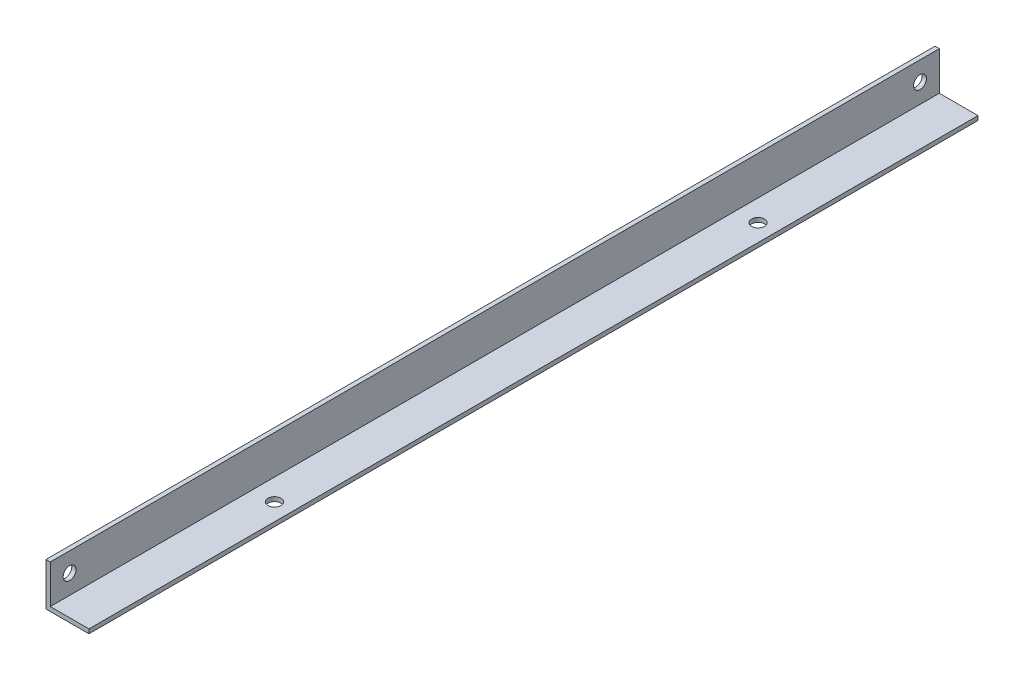
ISO-10303-21;
HEADER;
FILE_DESCRIPTION(('STEP AP214'),'2;1');
FILE_NAME('part.step','',(''),(''),'','','');
FILE_SCHEMA(('AUTOMOTIVE_DESIGN { 1 0 10303 214 1 1 1 1 }'));
ENDSEC;
DATA;
#1=APPLICATION_CONTEXT('core data for automotive mechanical design processes');
#2=APPLICATION_PROTOCOL_DEFINITION('international standard','automotive_design',2000,#1);
#3=PRODUCT_CONTEXT('',#1,'mechanical');
#4=PRODUCT('Part','Part','',(#3));
#5=PRODUCT_RELATED_PRODUCT_CATEGORY('part','',(#4));
#6=PRODUCT_DEFINITION_FORMATION('','',#4);
#7=PRODUCT_DEFINITION_CONTEXT('part definition',#1,'design');
#8=PRODUCT_DEFINITION('design','',#6,#7);
#9=PRODUCT_DEFINITION_SHAPE('','',#8);
#10=(LENGTH_UNIT() NAMED_UNIT(*) SI_UNIT(.MILLI.,.METRE.));
#11=(NAMED_UNIT(*) PLANE_ANGLE_UNIT() SI_UNIT($,.RADIAN.));
#12=(NAMED_UNIT(*) SI_UNIT($,.STERADIAN.) SOLID_ANGLE_UNIT());
#13=UNCERTAINTY_MEASURE_WITH_UNIT(LENGTH_MEASURE(1.E-05),#10,'distance_accuracy_value','');
#14=(GEOMETRIC_REPRESENTATION_CONTEXT(3) GLOBAL_UNCERTAINTY_ASSIGNED_CONTEXT((#13)) GLOBAL_UNIT_ASSIGNED_CONTEXT((#10,
#11,#12)) REPRESENTATION_CONTEXT('',''));
#15=CARTESIAN_POINT('',(0.,0.,0.));
#16=DIRECTION('',(0.,0.,1.));
#17=DIRECTION('',(1.,0.,0.));
#18=AXIS2_PLACEMENT_3D('',#15,#16,#17);
#19=CARTESIAN_POINT('',(0.,0.,103.5));
#20=DIRECTION('',(0.,1.,0.));
#21=DIRECTION('',(0.,0.,1.));
#22=AXIS2_PLACEMENT_3D('',#19,#20,#21);
#23=PLANE('',#22);
#24=CARTESIAN_POINT('',(6.,0.,-56.3));
#25=DIRECTION('',(0.,1.,0.));
#26=DIRECTION('',(0.,0.,1.));
#27=AXIS2_PLACEMENT_3D('',#24,#25,#26);
#28=CIRCLE('',#27,1.5);
#29=CARTESIAN_POINT('',(6.,0.,-54.8));
#30=VERTEX_POINT('',#29);
#31=EDGE_CURVE('E119',#30,#30,#28,.T.);
#32=ORIENTED_EDGE('',*,*,#31,.T.);
#33=EDGE_LOOP('',(#32));
#34=FACE_BOUND('',#33,.T.);
#35=CARTESIAN_POINT('',(6.,0.,56.3));
#36=DIRECTION('',(0.,1.,0.));
#37=DIRECTION('',(0.,0.,1.));
#38=AXIS2_PLACEMENT_3D('',#35,#36,#37);
#39=CIRCLE('',#38,1.5);
#40=CARTESIAN_POINT('',(6.,0.,57.8));
#41=VERTEX_POINT('',#40);
#42=EDGE_CURVE('E150',#41,#41,#39,.T.);
#43=ORIENTED_EDGE('',*,*,#42,.T.);
#44=EDGE_LOOP('',(#43));
#45=FACE_BOUND('',#44,.T.);
#46=DIRECTION('',(1.,0.,0.));
#47=VECTOR('',#46,1.);
#48=CARTESIAN_POINT('',(0.,0.,-103.5));
#49=LINE('',#48,#47);
#50=CARTESIAN_POINT('',(0.,0.,-103.5));
#51=VERTEX_POINT('',#50);
#52=CARTESIAN_POINT('',(10.,0.,-103.5));
#53=VERTEX_POINT('',#52);
#54=EDGE_CURVE('E115',#51,#53,#49,.T.);
#55=ORIENTED_EDGE('',*,*,#54,.T.);
#56=DIRECTION('',(0.,0.,-1.));
#57=VECTOR('',#56,1.);
#58=CARTESIAN_POINT('',(10.,0.,103.5));
#59=LINE('',#58,#57);
#60=CARTESIAN_POINT('',(10.,0.,103.5));
#61=VERTEX_POINT('',#60);
#62=EDGE_CURVE('E11',#61,#53,#59,.T.);
#63=ORIENTED_EDGE('',*,*,#62,.F.);
#64=DIRECTION('',(1.,0.,0.));
#65=VECTOR('',#64,1.);
#66=CARTESIAN_POINT('',(0.,0.,103.5));
#67=LINE('',#66,#65);
#68=CARTESIAN_POINT('',(0.,0.,103.5));
#69=VERTEX_POINT('',#68);
#70=EDGE_CURVE('E80',#69,#61,#67,.T.);
#71=ORIENTED_EDGE('',*,*,#70,.F.);
#72=DIRECTION('',(0.,0.,-1.));
#73=VECTOR('',#72,1.);
#74=CARTESIAN_POINT('',(0.,0.,103.5));
#75=LINE('',#74,#73);
#76=EDGE_CURVE('E111',#69,#51,#75,.T.);
#77=ORIENTED_EDGE('',*,*,#76,.T.);
#78=EDGE_LOOP('',(#55,#63,#71,#77));
#79=FACE_BOUND('',#78,.T.);
#80=ADVANCED_FACE('F32',(#34,#45,#79),#23,.F.);
#81=CARTESIAN_POINT('',(10.,1.,103.5));
#82=DIRECTION('',(1.,0.,0.));
#83=DIRECTION('',(0.,0.,-1.));
#84=AXIS2_PLACEMENT_3D('',#81,#82,#83);
#85=PLANE('',#84);
#86=DIRECTION('',(0.,-1.,0.));
#87=VECTOR('',#86,1.);
#88=CARTESIAN_POINT('',(10.,1.,-103.5));
#89=LINE('',#88,#87);
#90=CARTESIAN_POINT('',(10.,1.,-103.5));
#91=VERTEX_POINT('',#90);
#92=EDGE_CURVE('E118',#91,#53,#89,.T.);
#93=ORIENTED_EDGE('',*,*,#92,.F.);
#94=DIRECTION('',(0.,0.,-1.));
#95=VECTOR('',#94,1.);
#96=CARTESIAN_POINT('',(10.,1.,103.5));
#97=LINE('',#96,#95);
#98=CARTESIAN_POINT('',(10.,1.,103.5));
#99=VERTEX_POINT('',#98);
#100=EDGE_CURVE('E41',#99,#91,#97,.T.);
#101=ORIENTED_EDGE('',*,*,#100,.F.);
#102=DIRECTION('',(0.,-1.,0.));
#103=VECTOR('',#102,1.);
#104=CARTESIAN_POINT('',(10.,1.,103.5));
#105=LINE('',#104,#103);
#106=EDGE_CURVE('E158',#99,#61,#105,.T.);
#107=ORIENTED_EDGE('',*,*,#106,.T.);
#108=ORIENTED_EDGE('',*,*,#62,.T.);
#109=EDGE_LOOP('',(#93,#101,#107,#108));
#110=FACE_BOUND('',#109,.T.);
#111=ADVANCED_FACE('F180',(#110),#85,.T.);
#112=CARTESIAN_POINT('',(0.,1.,103.5));
#113=DIRECTION('',(0.,1.,0.));
#114=DIRECTION('',(0.,0.,1.));
#115=AXIS2_PLACEMENT_3D('',#112,#113,#114);
#116=PLANE('',#115);
#117=CARTESIAN_POINT('',(6.,1.,-56.3));
#118=DIRECTION('',(0.,1.,0.));
#119=DIRECTION('',(0.,0.,1.));
#120=AXIS2_PLACEMENT_3D('',#117,#118,#119);
#121=CIRCLE('',#120,1.5);
#122=CARTESIAN_POINT('',(6.,1.,-54.8));
#123=VERTEX_POINT('',#122);
#124=EDGE_CURVE('E147',#123,#123,#121,.T.);
#125=ORIENTED_EDGE('',*,*,#124,.F.);
#126=EDGE_LOOP('',(#125));
#127=FACE_BOUND('',#126,.T.);
#128=CARTESIAN_POINT('',(6.,1.,56.3));
#129=DIRECTION('',(0.,1.,0.));
#130=DIRECTION('',(0.,0.,-1.));
#131=AXIS2_PLACEMENT_3D('',#128,#129,#130);
#132=CIRCLE('',#131,1.5);
#133=CARTESIAN_POINT('',(6.,1.,54.8));
#134=VERTEX_POINT('',#133);
#135=EDGE_CURVE('E138',#134,#134,#132,.T.);
#136=ORIENTED_EDGE('',*,*,#135,.F.);
#137=EDGE_LOOP('',(#136));
#138=FACE_BOUND('',#137,.T.);
#139=DIRECTION('',(1.,0.,0.));
#140=VECTOR('',#139,1.);
#141=CARTESIAN_POINT('',(0.,1.,-103.5));
#142=LINE('',#141,#140);
#143=CARTESIAN_POINT('',(1.,1.,-103.5));
#144=VERTEX_POINT('',#143);
#145=EDGE_CURVE('E122',#144,#91,#142,.T.);
#146=ORIENTED_EDGE('',*,*,#145,.F.);
#147=DIRECTION('',(0.,0.,-1.));
#148=VECTOR('',#147,1.);
#149=CARTESIAN_POINT('',(1.,1.,103.5));
#150=LINE('',#149,#148);
#151=CARTESIAN_POINT('',(1.,1.,103.5));
#152=VERTEX_POINT('',#151);
#153=EDGE_CURVE('E101',#152,#144,#150,.T.);
#154=ORIENTED_EDGE('',*,*,#153,.F.);
#155=DIRECTION('',(1.,0.,0.));
#156=VECTOR('',#155,1.);
#157=CARTESIAN_POINT('',(0.,1.,103.5));
#158=LINE('',#157,#156);
#159=EDGE_CURVE('E107',#152,#99,#158,.T.);
#160=ORIENTED_EDGE('',*,*,#159,.T.);
#161=ORIENTED_EDGE('',*,*,#100,.T.);
#162=EDGE_LOOP('',(#146,#154,#160,#161));
#163=FACE_BOUND('',#162,.T.);
#164=ADVANCED_FACE('F162',(#127,#138,#163),#116,.T.);
#165=CARTESIAN_POINT('',(1.,10.,103.5));
#166=DIRECTION('',(1.,0.,0.));
#167=DIRECTION('',(0.,1.,0.));
#168=AXIS2_PLACEMENT_3D('',#165,#166,#167);
#169=PLANE('',#168);
#170=CARTESIAN_POINT('',(1.,5.5,99.));
#171=DIRECTION('',(1.,0.,0.));
#172=DIRECTION('',(0.,1.,0.));
#173=AXIS2_PLACEMENT_3D('',#170,#171,#172);
#174=CIRCLE('',#173,1.5);
#175=CARTESIAN_POINT('',(1.,7.,99.));
#176=VERTEX_POINT('',#175);
#177=EDGE_CURVE('E134',#176,#176,#174,.T.);
#178=ORIENTED_EDGE('',*,*,#177,.F.);
#179=EDGE_LOOP('',(#178));
#180=FACE_BOUND('',#179,.T.);
#181=CARTESIAN_POINT('',(1.,5.5,-99.));
#182=DIRECTION('',(1.,0.,0.));
#183=DIRECTION('',(0.,-1.,0.));
#184=AXIS2_PLACEMENT_3D('',#181,#182,#183);
#185=CIRCLE('',#184,1.5);
#186=CARTESIAN_POINT('',(1.,4.,-99.));
#187=VERTEX_POINT('',#186);
#188=EDGE_CURVE('E140',#187,#187,#185,.T.);
#189=ORIENTED_EDGE('',*,*,#188,.F.);
#190=EDGE_LOOP('',(#189));
#191=FACE_BOUND('',#190,.T.);
#192=DIRECTION('',(0.,-1.,0.));
#193=VECTOR('',#192,1.);
#194=CARTESIAN_POINT('',(1.,10.,-103.5));
#195=LINE('',#194,#193);
#196=CARTESIAN_POINT('',(1.,10.,-103.5));
#197=VERTEX_POINT('',#196);
#198=EDGE_CURVE('E96',#197,#144,#195,.T.);
#199=ORIENTED_EDGE('',*,*,#198,.F.);
#200=DIRECTION('',(0.,0.,-1.));
#201=VECTOR('',#200,1.);
#202=CARTESIAN_POINT('',(1.,10.,103.5));
#203=LINE('',#202,#201);
#204=CARTESIAN_POINT('',(1.,10.,103.5));
#205=VERTEX_POINT('',#204);
#206=EDGE_CURVE('E91',#205,#197,#203,.T.);
#207=ORIENTED_EDGE('',*,*,#206,.F.);
#208=DIRECTION('',(0.,-1.,0.));
#209=VECTOR('',#208,1.);
#210=CARTESIAN_POINT('',(1.,10.,103.5));
#211=LINE('',#210,#209);
#212=EDGE_CURVE('E94',#205,#152,#211,.T.);
#213=ORIENTED_EDGE('',*,*,#212,.T.);
#214=ORIENTED_EDGE('',*,*,#153,.T.);
#215=EDGE_LOOP('',(#199,#207,#213,#214));
#216=FACE_BOUND('',#215,.T.);
#217=ADVANCED_FACE('F93',(#180,#191,#216),#169,.T.);
#218=CARTESIAN_POINT('',(0.,10.,103.5));
#219=DIRECTION('',(0.,1.,0.));
#220=DIRECTION('',(0.,0.,1.));
#221=AXIS2_PLACEMENT_3D('',#218,#219,#220);
#222=PLANE('',#221);
#223=DIRECTION('',(1.,0.,0.));
#224=VECTOR('',#223,1.);
#225=CARTESIAN_POINT('',(0.,10.,-103.5));
#226=LINE('',#225,#224);
#227=CARTESIAN_POINT('',(0.,10.,-103.5));
#228=VERTEX_POINT('',#227);
#229=EDGE_CURVE('E126',#228,#197,#226,.T.);
#230=ORIENTED_EDGE('',*,*,#229,.F.);
#231=DIRECTION('',(0.,0.,-1.));
#232=VECTOR('',#231,1.);
#233=CARTESIAN_POINT('',(0.,10.,103.5));
#234=LINE('',#233,#232);
#235=CARTESIAN_POINT('',(0.,10.,103.5));
#236=VERTEX_POINT('',#235);
#237=EDGE_CURVE('E71',#236,#228,#234,.T.);
#238=ORIENTED_EDGE('',*,*,#237,.F.);
#239=DIRECTION('',(1.,0.,0.));
#240=VECTOR('',#239,1.);
#241=CARTESIAN_POINT('',(0.,10.,103.5));
#242=LINE('',#241,#240);
#243=EDGE_CURVE('E105',#236,#205,#242,.T.);
#244=ORIENTED_EDGE('',*,*,#243,.T.);
#245=ORIENTED_EDGE('',*,*,#206,.T.);
#246=EDGE_LOOP('',(#230,#238,#244,#245));
#247=FACE_BOUND('',#246,.T.);
#248=ADVANCED_FACE('F109',(#247),#222,.T.);
#249=CARTESIAN_POINT('',(0.,10.,103.5));
#250=DIRECTION('',(1.,0.,0.));
#251=DIRECTION('',(0.,1.,0.));
#252=AXIS2_PLACEMENT_3D('',#249,#250,#251);
#253=PLANE('',#252);
#254=CARTESIAN_POINT('',(0.,5.5,99.));
#255=DIRECTION('',(1.,0.,0.));
#256=DIRECTION('',(0.,1.,0.));
#257=AXIS2_PLACEMENT_3D('',#254,#255,#256);
#258=CIRCLE('',#257,1.5);
#259=CARTESIAN_POINT('',(0.,7.,99.));
#260=VERTEX_POINT('',#259);
#261=EDGE_CURVE('E35',#260,#260,#258,.T.);
#262=ORIENTED_EDGE('',*,*,#261,.T.);
#263=EDGE_LOOP('',(#262));
#264=FACE_BOUND('',#263,.T.);
#265=CARTESIAN_POINT('',(0.,5.5,-99.));
#266=DIRECTION('',(1.,0.,0.));
#267=DIRECTION('',(0.,1.,0.));
#268=AXIS2_PLACEMENT_3D('',#265,#266,#267);
#269=CIRCLE('',#268,1.5);
#270=CARTESIAN_POINT('',(0.,7.,-99.));
#271=VERTEX_POINT('',#270);
#272=EDGE_CURVE('E132',#271,#271,#269,.T.);
#273=ORIENTED_EDGE('',*,*,#272,.T.);
#274=EDGE_LOOP('',(#273));
#275=FACE_BOUND('',#274,.T.);
#276=DIRECTION('',(0.,-1.,0.));
#277=VECTOR('',#276,1.);
#278=CARTESIAN_POINT('',(0.,10.,-103.5));
#279=LINE('',#278,#277);
#280=EDGE_CURVE('E74',#228,#51,#279,.T.);
#281=ORIENTED_EDGE('',*,*,#280,.T.);
#282=ORIENTED_EDGE('',*,*,#76,.F.);
#283=DIRECTION('',(0.,-1.,0.));
#284=VECTOR('',#283,1.);
#285=CARTESIAN_POINT('',(0.,10.,103.5));
#286=LINE('',#285,#284);
#287=EDGE_CURVE('E50',#236,#69,#286,.T.);
#288=ORIENTED_EDGE('',*,*,#287,.F.);
#289=ORIENTED_EDGE('',*,*,#237,.T.);
#290=EDGE_LOOP('',(#281,#282,#288,#289));
#291=FACE_BOUND('',#290,.T.);
#292=ADVANCED_FACE('F168',(#264,#275,#291),#253,.F.);
#293=CARTESIAN_POINT('',(0.,0.,103.5));
#294=DIRECTION('',(0.,0.,-1.));
#295=DIRECTION('',(-1.,0.,0.));
#296=AXIS2_PLACEMENT_3D('',#293,#294,#295);
#297=PLANE('',#296);
#298=ORIENTED_EDGE('',*,*,#70,.T.);
#299=ORIENTED_EDGE('',*,*,#106,.F.);
#300=ORIENTED_EDGE('',*,*,#159,.F.);
#301=ORIENTED_EDGE('',*,*,#212,.F.);
#302=ORIENTED_EDGE('',*,*,#243,.F.);
#303=ORIENTED_EDGE('',*,*,#287,.T.);
#304=EDGE_LOOP('',(#298,#299,#300,#301,#302,#303));
#305=FACE_BOUND('',#304,.T.);
#306=ADVANCED_FACE('F104',(#305),#297,.F.);
#307=CARTESIAN_POINT('',(0.,0.,-103.5));
#308=DIRECTION('',(0.,0.,-1.));
#309=DIRECTION('',(-1.,0.,0.));
#310=AXIS2_PLACEMENT_3D('',#307,#308,#309);
#311=PLANE('',#310);
#312=ORIENTED_EDGE('',*,*,#54,.F.);
#313=ORIENTED_EDGE('',*,*,#280,.F.);
#314=ORIENTED_EDGE('',*,*,#229,.T.);
#315=ORIENTED_EDGE('',*,*,#198,.T.);
#316=ORIENTED_EDGE('',*,*,#145,.T.);
#317=ORIENTED_EDGE('',*,*,#92,.T.);
#318=EDGE_LOOP('',(#312,#313,#314,#315,#316,#317));
#319=FACE_BOUND('',#318,.T.);
#320=ADVANCED_FACE('F166',(#319),#311,.T.);
#321=CARTESIAN_POINT('',(6.,-2.,56.3));
#322=DIRECTION('',(0.,1.,0.));
#323=DIRECTION('',(0.,0.,1.));
#324=AXIS2_PLACEMENT_3D('',#321,#322,#323);
#325=CYLINDRICAL_SURFACE('',#324,1.5);
#326=ORIENTED_EDGE('',*,*,#135,.T.);
#327=EDGE_LOOP('',(#326));
#328=FACE_BOUND('',#327,.T.);
#329=ORIENTED_EDGE('',*,*,#42,.F.);
#330=EDGE_LOOP('',(#329));
#331=FACE_BOUND('',#330,.T.);
#332=ADVANCED_FACE('F190',(#328,#331),#325,.F.);
#333=CARTESIAN_POINT('',(6.,-2.,-56.3));
#334=DIRECTION('',(0.,1.,0.));
#335=DIRECTION('',(0.,0.,1.));
#336=AXIS2_PLACEMENT_3D('',#333,#334,#335);
#337=CYLINDRICAL_SURFACE('',#336,1.5);
#338=ORIENTED_EDGE('',*,*,#124,.T.);
#339=EDGE_LOOP('',(#338));
#340=FACE_BOUND('',#339,.T.);
#341=ORIENTED_EDGE('',*,*,#31,.F.);
#342=EDGE_LOOP('',(#341));
#343=FACE_BOUND('',#342,.T.);
#344=ADVANCED_FACE('F192',(#340,#343),#337,.F.);
#345=CARTESIAN_POINT('',(-2.,5.5,-99.));
#346=DIRECTION('',(1.,0.,0.));
#347=DIRECTION('',(0.,1.,0.));
#348=AXIS2_PLACEMENT_3D('',#345,#346,#347);
#349=CYLINDRICAL_SURFACE('',#348,1.5);
#350=ORIENTED_EDGE('',*,*,#188,.T.);
#351=EDGE_LOOP('',(#350));
#352=FACE_BOUND('',#351,.T.);
#353=ORIENTED_EDGE('',*,*,#272,.F.);
#354=EDGE_LOOP('',(#353));
#355=FACE_BOUND('',#354,.T.);
#356=ADVANCED_FACE('F199',(#352,#355),#349,.F.);
#357=CARTESIAN_POINT('',(-2.,5.5,99.));
#358=DIRECTION('',(1.,0.,0.));
#359=DIRECTION('',(0.,1.,0.));
#360=AXIS2_PLACEMENT_3D('',#357,#358,#359);
#361=CYLINDRICAL_SURFACE('',#360,1.5);
#362=ORIENTED_EDGE('',*,*,#177,.T.);
#363=EDGE_LOOP('',(#362));
#364=FACE_BOUND('',#363,.T.);
#365=ORIENTED_EDGE('',*,*,#261,.F.);
#366=EDGE_LOOP('',(#365));
#367=FACE_BOUND('',#366,.T.);
#368=ADVANCED_FACE('F205',(#364,#367),#361,.F.);
#369=CLOSED_SHELL('',(#80,#111,#164,#217,#248,#292,#306,#320,#332,#344,#356,#368));
#370=MANIFOLD_SOLID_BREP('B2',#369);
#371=ADVANCED_BREP_SHAPE_REPRESENTATION('',(#18,#370),#14);
#372=SHAPE_DEFINITION_REPRESENTATION(#9,#371);
ENDSEC;
END-ISO-10303-21;
